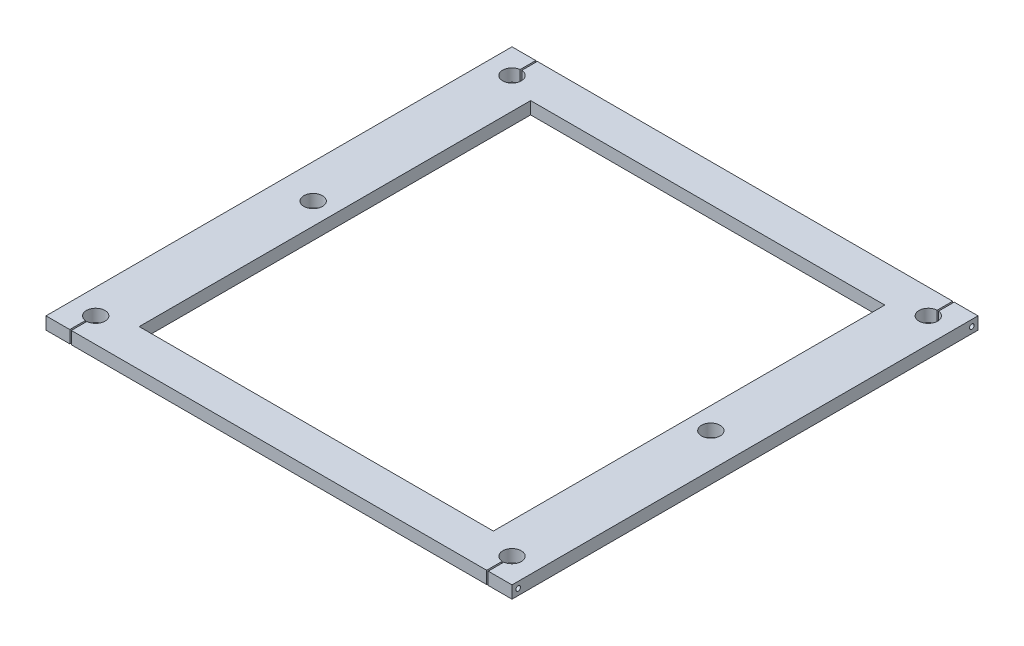
ISO-10303-21;
HEADER;
FILE_DESCRIPTION(('STEP AP214'),'2;1');
FILE_NAME('part.step','',(''),(''),'','','');
FILE_SCHEMA(('AUTOMOTIVE_DESIGN { 1 0 10303 214 1 1 1 1 }'));
ENDSEC;
DATA;
#1=APPLICATION_CONTEXT('core data for automotive mechanical design processes');
#2=APPLICATION_PROTOCOL_DEFINITION('international standard','automotive_design',2000,#1);
#3=PRODUCT_CONTEXT('',#1,'mechanical');
#4=PRODUCT('Part','Part','',(#3));
#5=PRODUCT_RELATED_PRODUCT_CATEGORY('part','',(#4));
#6=PRODUCT_DEFINITION_FORMATION('','',#4);
#7=PRODUCT_DEFINITION_CONTEXT('part definition',#1,'design');
#8=PRODUCT_DEFINITION('design','',#6,#7);
#9=PRODUCT_DEFINITION_SHAPE('','',#8);
#10=(LENGTH_UNIT() NAMED_UNIT(*) SI_UNIT(.MILLI.,.METRE.));
#11=(NAMED_UNIT(*) PLANE_ANGLE_UNIT() SI_UNIT($,.RADIAN.));
#12=(NAMED_UNIT(*) SI_UNIT($,.STERADIAN.) SOLID_ANGLE_UNIT());
#13=UNCERTAINTY_MEASURE_WITH_UNIT(LENGTH_MEASURE(1.E-05),#10,'distance_accuracy_value','');
#14=(GEOMETRIC_REPRESENTATION_CONTEXT(3) GLOBAL_UNCERTAINTY_ASSIGNED_CONTEXT((#13)) GLOBAL_UNIT_ASSIGNED_CONTEXT((#10,
#11,#12)) REPRESENTATION_CONTEXT('',''));
#15=CARTESIAN_POINT('',(0.,0.,0.));
#16=DIRECTION('',(0.,0.,1.));
#17=DIRECTION('',(1.,0.,0.));
#18=AXIS2_PLACEMENT_3D('',#15,#16,#17);
#19=CARTESIAN_POINT('',(0.,8.,0.));
#20=DIRECTION('',(0.,-1.,0.));
#21=DIRECTION('',(0.,0.,-1.));
#22=AXIS2_PLACEMENT_3D('',#19,#20,#21);
#23=PLANE('',#22);
#24=CARTESIAN_POINT('',(128.,8.,0.));
#25=DIRECTION('',(0.,-1.,0.));
#26=DIRECTION('',(0.,0.,1.));
#27=AXIS2_PLACEMENT_3D('',#24,#25,#26);
#28=CIRCLE('',#27,6.);
#29=CARTESIAN_POINT('',(128.,8.,6.00000000000002));
#30=VERTEX_POINT('',#29);
#31=EDGE_CURVE('E406',#30,#30,#28,.T.);
#32=ORIENTED_EDGE('',*,*,#31,.T.);
#33=EDGE_LOOP('',(#32));
#34=FACE_BOUND('',#33,.T.);
#35=DIRECTION('',(0.,0.,-1.));
#36=VECTOR('',#35,1.);
#37=CARTESIAN_POINT('',(-133.7,8.,150.));
#38=LINE('',#37,#36);
#39=CARTESIAN_POINT('',(-133.7,8.,150.));
#40=VERTEX_POINT('',#39);
#41=CARTESIAN_POINT('',(-133.7,8.,139.992495306631));
#42=VERTEX_POINT('',#41);
#43=EDGE_CURVE('E196',#40,#42,#38,.T.);
#44=ORIENTED_EDGE('',*,*,#43,.F.);
#45=DIRECTION('',(1.,0.,0.));
#46=VECTOR('',#45,1.);
#47=CARTESIAN_POINT('',(-150.,8.,150.));
#48=LINE('',#47,#46);
#49=CARTESIAN_POINT('',(133.7,8.,150.));
#50=VERTEX_POINT('',#49);
#51=EDGE_CURVE('E359',#40,#50,#48,.T.);
#52=ORIENTED_EDGE('',*,*,#51,.T.);
#53=DIRECTION('',(0.,0.,-1.));
#54=VECTOR('',#53,1.);
#55=CARTESIAN_POINT('',(133.7,8.,150.));
#56=LINE('',#55,#54);
#57=CARTESIAN_POINT('',(133.7,8.,139.992495306631));
#58=VERTEX_POINT('',#57);
#59=EDGE_CURVE('E260',#50,#58,#56,.T.);
#60=ORIENTED_EDGE('',*,*,#59,.T.);
#61=CARTESIAN_POINT('',(134.,8.,134.));
#62=DIRECTION('',(0.,-1.,0.));
#63=DIRECTION('',(0.,0.,-1.));
#64=AXIS2_PLACEMENT_3D('',#61,#62,#63);
#65=CIRCLE('',#64,6.);
#66=CARTESIAN_POINT('',(134.7,8.,139.959026766176));
#67=VERTEX_POINT('',#66);
#68=EDGE_CURVE('E267',#58,#67,#65,.T.);
#69=ORIENTED_EDGE('',*,*,#68,.T.);
#70=DIRECTION('',(0.,0.,1.));
#71=VECTOR('',#70,1.);
#72=CARTESIAN_POINT('',(134.7,8.,150.));
#73=LINE('',#72,#71);
#74=CARTESIAN_POINT('',(134.7,8.,150.));
#75=VERTEX_POINT('',#74);
#76=EDGE_CURVE('E263',#67,#75,#73,.T.);
#77=ORIENTED_EDGE('',*,*,#76,.T.);
#78=CARTESIAN_POINT('',(150.,8.,150.));
#79=VERTEX_POINT('',#78);
#80=EDGE_CURVE('E355',#75,#79,#48,.T.);
#81=ORIENTED_EDGE('',*,*,#80,.T.);
#82=DIRECTION('',(0.,0.,-1.));
#83=VECTOR('',#82,1.);
#84=CARTESIAN_POINT('',(150.,8.,-150.));
#85=LINE('',#84,#83);
#86=CARTESIAN_POINT('',(150.,8.,-150.));
#87=VERTEX_POINT('',#86);
#88=EDGE_CURVE('E358',#79,#87,#85,.T.);
#89=ORIENTED_EDGE('',*,*,#88,.T.);
#90=DIRECTION('',(-1.,0.,0.));
#91=VECTOR('',#90,1.);
#92=CARTESIAN_POINT('',(-150.,8.,-150.));
#93=LINE('',#92,#91);
#94=CARTESIAN_POINT('',(134.7,8.,-150.));
#95=VERTEX_POINT('',#94);
#96=EDGE_CURVE('E348',#87,#95,#93,.T.);
#97=ORIENTED_EDGE('',*,*,#96,.T.);
#98=DIRECTION('',(0.,0.,-1.));
#99=VECTOR('',#98,1.);
#100=CARTESIAN_POINT('',(134.7,8.,-150.));
#101=LINE('',#100,#99);
#102=CARTESIAN_POINT('',(134.7,8.,-139.959026766176));
#103=VERTEX_POINT('',#102);
#104=EDGE_CURVE('E296',#103,#95,#101,.T.);
#105=ORIENTED_EDGE('',*,*,#104,.F.);
#106=CARTESIAN_POINT('',(134.,8.,-134.));
#107=DIRECTION('',(0.,1.,0.));
#108=DIRECTION('',(0.,0.,1.));
#109=AXIS2_PLACEMENT_3D('',#106,#107,#108);
#110=CIRCLE('',#109,6.);
#111=CARTESIAN_POINT('',(133.7,8.,-139.992495306631));
#112=VERTEX_POINT('',#111);
#113=EDGE_CURVE('E293',#112,#103,#110,.T.);
#114=ORIENTED_EDGE('',*,*,#113,.F.);
#115=DIRECTION('',(0.,0.,1.));
#116=VECTOR('',#115,1.);
#117=CARTESIAN_POINT('',(133.7,8.,-150.));
#118=LINE('',#117,#116);
#119=CARTESIAN_POINT('',(133.7,8.,-150.));
#120=VERTEX_POINT('',#119);
#121=EDGE_CURVE('E291',#120,#112,#118,.T.);
#122=ORIENTED_EDGE('',*,*,#121,.F.);
#123=CARTESIAN_POINT('',(-133.7,8.,-150.));
#124=VERTEX_POINT('',#123);
#125=EDGE_CURVE('E352',#120,#124,#93,.T.);
#126=ORIENTED_EDGE('',*,*,#125,.T.);
#127=DIRECTION('',(0.,0.,1.));
#128=VECTOR('',#127,1.);
#129=CARTESIAN_POINT('',(-133.7,8.,-150.));
#130=LINE('',#129,#128);
#131=CARTESIAN_POINT('',(-133.7,8.,-139.992495306631));
#132=VERTEX_POINT('',#131);
#133=EDGE_CURVE('E233',#124,#132,#130,.T.);
#134=ORIENTED_EDGE('',*,*,#133,.T.);
#135=CARTESIAN_POINT('',(-134.,8.,-134.));
#136=DIRECTION('',(0.,-1.,0.));
#137=DIRECTION('',(0.,0.,1.));
#138=AXIS2_PLACEMENT_3D('',#135,#136,#137);
#139=CIRCLE('',#138,6.);
#140=CARTESIAN_POINT('',(-134.7,8.,-139.959026766176));
#141=VERTEX_POINT('',#140);
#142=EDGE_CURVE('E240',#132,#141,#139,.T.);
#143=ORIENTED_EDGE('',*,*,#142,.T.);
#144=DIRECTION('',(0.,0.,-1.));
#145=VECTOR('',#144,1.);
#146=CARTESIAN_POINT('',(-134.7,8.,-150.));
#147=LINE('',#146,#145);
#148=CARTESIAN_POINT('',(-134.7,8.,-150.));
#149=VERTEX_POINT('',#148);
#150=EDGE_CURVE('E236',#141,#149,#147,.T.);
#151=ORIENTED_EDGE('',*,*,#150,.T.);
#152=CARTESIAN_POINT('',(-150.,8.,-150.));
#153=VERTEX_POINT('',#152);
#154=EDGE_CURVE('E353',#149,#153,#93,.T.);
#155=ORIENTED_EDGE('',*,*,#154,.T.);
#156=DIRECTION('',(0.,0.,1.));
#157=VECTOR('',#156,1.);
#158=CARTESIAN_POINT('',(-150.,8.,150.));
#159=LINE('',#158,#157);
#160=CARTESIAN_POINT('',(-150.,8.,150.));
#161=VERTEX_POINT('',#160);
#162=EDGE_CURVE('E351',#153,#161,#159,.T.);
#163=ORIENTED_EDGE('',*,*,#162,.T.);
#164=CARTESIAN_POINT('',(-134.7,8.,150.));
#165=VERTEX_POINT('',#164);
#166=EDGE_CURVE('E356',#161,#165,#48,.T.);
#167=ORIENTED_EDGE('',*,*,#166,.T.);
#168=DIRECTION('',(0.,0.,1.));
#169=VECTOR('',#168,1.);
#170=CARTESIAN_POINT('',(-134.7,8.,150.));
#171=LINE('',#170,#169);
#172=CARTESIAN_POINT('',(-134.7,8.,139.959026766176));
#173=VERTEX_POINT('',#172);
#174=EDGE_CURVE('E220',#173,#165,#171,.T.);
#175=ORIENTED_EDGE('',*,*,#174,.F.);
#176=CARTESIAN_POINT('',(-134.,8.,134.));
#177=DIRECTION('',(0.,1.,0.));
#178=DIRECTION('',(0.,0.,-1.));
#179=AXIS2_PLACEMENT_3D('',#176,#177,#178);
#180=CIRCLE('',#179,6.);
#181=EDGE_CURVE('E206',#42,#173,#180,.T.);
#182=ORIENTED_EDGE('',*,*,#181,.F.);
#183=EDGE_LOOP('',(#44,#52,#60,#69,#77,#81,#89,#97,#105,#114,#122,#126,#134,#143,#151,#155,#163,
#167,#175,#182));
#184=FACE_BOUND('',#183,.T.);
#185=DIRECTION('',(0.,0.,-1.));
#186=VECTOR('',#185,1.);
#187=CARTESIAN_POINT('',(114.,8.,126.));
#188=LINE('',#187,#186);
#189=CARTESIAN_POINT('',(114.,8.,126.));
#190=VERTEX_POINT('',#189);
#191=CARTESIAN_POINT('',(114.,8.,-126.));
#192=VERTEX_POINT('',#191);
#193=EDGE_CURVE('E317',#190,#192,#188,.T.);
#194=ORIENTED_EDGE('',*,*,#193,.F.);
#195=DIRECTION('',(1.,0.,0.));
#196=VECTOR('',#195,1.);
#197=CARTESIAN_POINT('',(-114.,8.,126.));
#198=LINE('',#197,#196);
#199=CARTESIAN_POINT('',(-114.,8.,126.));
#200=VERTEX_POINT('',#199);
#201=EDGE_CURVE('E325',#200,#190,#198,.T.);
#202=ORIENTED_EDGE('',*,*,#201,.F.);
#203=DIRECTION('',(0.,0.,1.));
#204=VECTOR('',#203,1.);
#205=CARTESIAN_POINT('',(-114.,8.,126.));
#206=LINE('',#205,#204);
#207=CARTESIAN_POINT('',(-114.,8.,-126.));
#208=VERTEX_POINT('',#207);
#209=EDGE_CURVE('E322',#208,#200,#206,.T.);
#210=ORIENTED_EDGE('',*,*,#209,.F.);
#211=DIRECTION('',(-1.,0.,0.));
#212=VECTOR('',#211,1.);
#213=CARTESIAN_POINT('',(-114.,8.,-126.));
#214=LINE('',#213,#212);
#215=EDGE_CURVE('E319',#192,#208,#214,.T.);
#216=ORIENTED_EDGE('',*,*,#215,.F.);
#217=EDGE_LOOP('',(#194,#202,#210,#216));
#218=FACE_BOUND('',#217,.T.);
#219=CARTESIAN_POINT('',(-128.,8.,0.));
#220=DIRECTION('',(0.,1.,0.));
#221=DIRECTION('',(0.,0.,1.));
#222=AXIS2_PLACEMENT_3D('',#219,#220,#221);
#223=CIRCLE('',#222,6.);
#224=CARTESIAN_POINT('',(-128.,8.,6.00000000000002));
#225=VERTEX_POINT('',#224);
#226=EDGE_CURVE('E402',#225,#225,#223,.T.);
#227=ORIENTED_EDGE('',*,*,#226,.F.);
#228=EDGE_LOOP('',(#227));
#229=FACE_BOUND('',#228,.T.);
#230=ADVANCED_FACE('F32',(#34,#184,#218,#229),#23,.F.);
#231=CARTESIAN_POINT('',(0.,0.,0.));
#232=DIRECTION('',(0.,-1.,0.));
#233=DIRECTION('',(0.,0.,-1.));
#234=AXIS2_PLACEMENT_3D('',#231,#232,#233);
#235=PLANE('',#234);
#236=CARTESIAN_POINT('',(128.,0.,0.));
#237=DIRECTION('',(0.,-1.,0.));
#238=DIRECTION('',(0.,0.,1.));
#239=AXIS2_PLACEMENT_3D('',#236,#237,#238);
#240=CIRCLE('',#239,6.);
#241=CARTESIAN_POINT('',(128.,0.,6.00000000000002));
#242=VERTEX_POINT('',#241);
#243=EDGE_CURVE('E409',#242,#242,#240,.T.);
#244=ORIENTED_EDGE('',*,*,#243,.F.);
#245=EDGE_LOOP('',(#244));
#246=FACE_BOUND('',#245,.T.);
#247=DIRECTION('',(1.,0.,0.));
#248=VECTOR('',#247,1.);
#249=CARTESIAN_POINT('',(-150.,0.,150.));
#250=LINE('',#249,#248);
#251=CARTESIAN_POINT('',(-133.7,0.,150.));
#252=VERTEX_POINT('',#251);
#253=CARTESIAN_POINT('',(133.7,0.,150.));
#254=VERTEX_POINT('',#253);
#255=EDGE_CURVE('E373',#252,#254,#250,.T.);
#256=ORIENTED_EDGE('',*,*,#255,.F.);
#257=DIRECTION('',(0.,0.,-1.));
#258=VECTOR('',#257,1.);
#259=CARTESIAN_POINT('',(-133.7,0.,150.));
#260=LINE('',#259,#258);
#261=CARTESIAN_POINT('',(-133.7,0.,139.992495306631));
#262=VERTEX_POINT('',#261);
#263=EDGE_CURVE('E225',#252,#262,#260,.T.);
#264=ORIENTED_EDGE('',*,*,#263,.T.);
#265=CARTESIAN_POINT('',(-134.,0.,134.));
#266=DIRECTION('',(0.,1.,0.));
#267=DIRECTION('',(0.,0.,-1.));
#268=AXIS2_PLACEMENT_3D('',#265,#266,#267);
#269=CIRCLE('',#268,6.);
#270=CARTESIAN_POINT('',(-134.7,0.,139.959026766176));
#271=VERTEX_POINT('',#270);
#272=EDGE_CURVE('E213',#262,#271,#269,.T.);
#273=ORIENTED_EDGE('',*,*,#272,.T.);
#274=DIRECTION('',(0.,0.,1.));
#275=VECTOR('',#274,1.);
#276=CARTESIAN_POINT('',(-134.7,0.,150.));
#277=LINE('',#276,#275);
#278=CARTESIAN_POINT('',(-134.7,0.,150.));
#279=VERTEX_POINT('',#278);
#280=EDGE_CURVE('E207',#271,#279,#277,.T.);
#281=ORIENTED_EDGE('',*,*,#280,.T.);
#282=CARTESIAN_POINT('',(-150.,0.,150.));
#283=VERTEX_POINT('',#282);
#284=EDGE_CURVE('E369',#283,#279,#250,.T.);
#285=ORIENTED_EDGE('',*,*,#284,.F.);
#286=DIRECTION('',(0.,0.,1.));
#287=VECTOR('',#286,1.);
#288=CARTESIAN_POINT('',(-150.,0.,150.));
#289=LINE('',#288,#287);
#290=CARTESIAN_POINT('',(-150.,0.,-150.));
#291=VERTEX_POINT('',#290);
#292=EDGE_CURVE('E365',#291,#283,#289,.T.);
#293=ORIENTED_EDGE('',*,*,#292,.F.);
#294=DIRECTION('',(-1.,0.,0.));
#295=VECTOR('',#294,1.);
#296=CARTESIAN_POINT('',(-150.,0.,-150.));
#297=LINE('',#296,#295);
#298=CARTESIAN_POINT('',(-134.7,0.,-150.));
#299=VERTEX_POINT('',#298);
#300=EDGE_CURVE('E347',#299,#291,#297,.T.);
#301=ORIENTED_EDGE('',*,*,#300,.F.);
#302=DIRECTION('',(0.,0.,-1.));
#303=VECTOR('',#302,1.);
#304=CARTESIAN_POINT('',(-134.7,0.,-150.));
#305=LINE('',#304,#303);
#306=CARTESIAN_POINT('',(-134.7,0.,-139.959026766176));
#307=VERTEX_POINT('',#306);
#308=EDGE_CURVE('E57',#307,#299,#305,.T.);
#309=ORIENTED_EDGE('',*,*,#308,.F.);
#310=CARTESIAN_POINT('',(-134.,0.,-134.));
#311=DIRECTION('',(0.,-1.,0.));
#312=DIRECTION('',(0.,0.,1.));
#313=AXIS2_PLACEMENT_3D('',#310,#311,#312);
#314=CIRCLE('',#313,6.);
#315=CARTESIAN_POINT('',(-133.7,0.,-139.992495306631));
#316=VERTEX_POINT('',#315);
#317=EDGE_CURVE('E237',#316,#307,#314,.T.);
#318=ORIENTED_EDGE('',*,*,#317,.F.);
#319=DIRECTION('',(0.,0.,1.));
#320=VECTOR('',#319,1.);
#321=CARTESIAN_POINT('',(-133.7,0.,-150.));
#322=LINE('',#321,#320);
#323=CARTESIAN_POINT('',(-133.7,0.,-150.));
#324=VERTEX_POINT('',#323);
#325=EDGE_CURVE('E214',#324,#316,#322,.T.);
#326=ORIENTED_EDGE('',*,*,#325,.F.);
#327=CARTESIAN_POINT('',(133.7,0.,-150.));
#328=VERTEX_POINT('',#327);
#329=EDGE_CURVE('E366',#328,#324,#297,.T.);
#330=ORIENTED_EDGE('',*,*,#329,.F.);
#331=DIRECTION('',(0.,0.,1.));
#332=VECTOR('',#331,1.);
#333=CARTESIAN_POINT('',(133.7,0.,-150.));
#334=LINE('',#333,#332);
#335=CARTESIAN_POINT('',(133.7,0.,-139.992495306631));
#336=VERTEX_POINT('',#335);
#337=EDGE_CURVE('E299',#328,#336,#334,.T.);
#338=ORIENTED_EDGE('',*,*,#337,.T.);
#339=CARTESIAN_POINT('',(134.,0.,-134.));
#340=DIRECTION('',(0.,1.,0.));
#341=DIRECTION('',(0.,0.,1.));
#342=AXIS2_PLACEMENT_3D('',#339,#340,#341);
#343=CIRCLE('',#342,6.);
#344=CARTESIAN_POINT('',(134.7,0.,-139.959026766176));
#345=VERTEX_POINT('',#344);
#346=EDGE_CURVE('E302',#336,#345,#343,.T.);
#347=ORIENTED_EDGE('',*,*,#346,.T.);
#348=DIRECTION('',(0.,0.,-1.));
#349=VECTOR('',#348,1.);
#350=CARTESIAN_POINT('',(134.7,0.,-150.));
#351=LINE('',#350,#349);
#352=CARTESIAN_POINT('',(134.7,0.,-150.));
#353=VERTEX_POINT('',#352);
#354=EDGE_CURVE('E294',#345,#353,#351,.T.);
#355=ORIENTED_EDGE('',*,*,#354,.T.);
#356=CARTESIAN_POINT('',(150.,0.,-150.));
#357=VERTEX_POINT('',#356);
#358=EDGE_CURVE('E362',#357,#353,#297,.T.);
#359=ORIENTED_EDGE('',*,*,#358,.F.);
#360=DIRECTION('',(0.,0.,-1.));
#361=VECTOR('',#360,1.);
#362=CARTESIAN_POINT('',(150.,0.,-150.));
#363=LINE('',#362,#361);
#364=CARTESIAN_POINT('',(150.,0.,150.));
#365=VERTEX_POINT('',#364);
#366=EDGE_CURVE('E372',#365,#357,#363,.T.);
#367=ORIENTED_EDGE('',*,*,#366,.F.);
#368=CARTESIAN_POINT('',(134.7,0.,150.));
#369=VERTEX_POINT('',#368);
#370=EDGE_CURVE('E368',#369,#365,#250,.T.);
#371=ORIENTED_EDGE('',*,*,#370,.F.);
#372=DIRECTION('',(0.,0.,1.));
#373=VECTOR('',#372,1.);
#374=CARTESIAN_POINT('',(134.7,0.,150.));
#375=LINE('',#374,#373);
#376=CARTESIAN_POINT('',(134.7,0.,139.959026766176));
#377=VERTEX_POINT('',#376);
#378=EDGE_CURVE('E274',#377,#369,#375,.T.);
#379=ORIENTED_EDGE('',*,*,#378,.F.);
#380=CARTESIAN_POINT('',(134.,0.,134.));
#381=DIRECTION('',(0.,-1.,0.));
#382=DIRECTION('',(0.,0.,-1.));
#383=AXIS2_PLACEMENT_3D('',#380,#381,#382);
#384=CIRCLE('',#383,6.);
#385=CARTESIAN_POINT('',(133.7,0.,139.992495306631));
#386=VERTEX_POINT('',#385);
#387=EDGE_CURVE('E264',#386,#377,#384,.T.);
#388=ORIENTED_EDGE('',*,*,#387,.F.);
#389=DIRECTION('',(0.,0.,-1.));
#390=VECTOR('',#389,1.);
#391=CARTESIAN_POINT('',(133.7,0.,150.));
#392=LINE('',#391,#390);
#393=EDGE_CURVE('E271',#254,#386,#392,.T.);
#394=ORIENTED_EDGE('',*,*,#393,.F.);
#395=EDGE_LOOP('',(#256,#264,#273,#281,#285,#293,#301,#309,#318,#326,#330,#338,#347,#355,#359,
#367,#371,#379,#388,#394));
#396=FACE_BOUND('',#395,.T.);
#397=DIRECTION('',(1.,0.,0.));
#398=VECTOR('',#397,1.);
#399=CARTESIAN_POINT('',(-114.,0.,126.));
#400=LINE('',#399,#398);
#401=CARTESIAN_POINT('',(-114.,0.,126.));
#402=VERTEX_POINT('',#401);
#403=CARTESIAN_POINT('',(114.,0.,126.));
#404=VERTEX_POINT('',#403);
#405=EDGE_CURVE('E320',#402,#404,#400,.T.);
#406=ORIENTED_EDGE('',*,*,#405,.T.);
#407=DIRECTION('',(0.,0.,-1.));
#408=VECTOR('',#407,1.);
#409=CARTESIAN_POINT('',(114.,0.,126.));
#410=LINE('',#409,#408);
#411=CARTESIAN_POINT('',(114.,0.,-126.));
#412=VERTEX_POINT('',#411);
#413=EDGE_CURVE('E316',#404,#412,#410,.T.);
#414=ORIENTED_EDGE('',*,*,#413,.T.);
#415=DIRECTION('',(-1.,0.,0.));
#416=VECTOR('',#415,1.);
#417=CARTESIAN_POINT('',(-114.,0.,-126.));
#418=LINE('',#417,#416);
#419=CARTESIAN_POINT('',(-114.,0.,-126.));
#420=VERTEX_POINT('',#419);
#421=EDGE_CURVE('E330',#412,#420,#418,.T.);
#422=ORIENTED_EDGE('',*,*,#421,.T.);
#423=DIRECTION('',(0.,0.,1.));
#424=VECTOR('',#423,1.);
#425=CARTESIAN_POINT('',(-114.,0.,126.));
#426=LINE('',#425,#424);
#427=EDGE_CURVE('E333',#420,#402,#426,.T.);
#428=ORIENTED_EDGE('',*,*,#427,.T.);
#429=EDGE_LOOP('',(#406,#414,#422,#428));
#430=FACE_BOUND('',#429,.T.);
#431=CARTESIAN_POINT('',(-128.,0.,0.));
#432=DIRECTION('',(0.,1.,0.));
#433=DIRECTION('',(0.,0.,1.));
#434=AXIS2_PLACEMENT_3D('',#431,#432,#433);
#435=CIRCLE('',#434,6.);
#436=CARTESIAN_POINT('',(-128.,0.,6.00000000000002));
#437=VERTEX_POINT('',#436);
#438=EDGE_CURVE('E403',#437,#437,#435,.T.);
#439=ORIENTED_EDGE('',*,*,#438,.T.);
#440=EDGE_LOOP('',(#439));
#441=FACE_BOUND('',#440,.T.);
#442=ADVANCED_FACE('F423',(#246,#396,#430,#441),#235,.T.);
#443=CARTESIAN_POINT('',(-150.,8.,150.));
#444=DIRECTION('',(1.,0.,0.));
#445=DIRECTION('',(0.,0.,-1.));
#446=AXIS2_PLACEMENT_3D('',#443,#444,#445);
#447=PLANE('',#446);
#448=ORIENTED_EDGE('',*,*,#292,.T.);
#449=DIRECTION('',(0.,-1.,0.));
#450=VECTOR('',#449,1.);
#451=CARTESIAN_POINT('',(-150.,8.,150.));
#452=LINE('',#451,#450);
#453=EDGE_CURVE('E41',#161,#283,#452,.T.);
#454=ORIENTED_EDGE('',*,*,#453,.F.);
#455=ORIENTED_EDGE('',*,*,#162,.F.);
#456=DIRECTION('',(0.,-1.,0.));
#457=VECTOR('',#456,1.);
#458=CARTESIAN_POINT('',(-150.,8.,-150.));
#459=LINE('',#458,#457);
#460=EDGE_CURVE('E11',#153,#291,#459,.T.);
#461=ORIENTED_EDGE('',*,*,#460,.T.);
#462=EDGE_LOOP('',(#448,#454,#455,#461));
#463=FACE_BOUND('',#462,.T.);
#464=CARTESIAN_POINT('',(-150.,4.,146.));
#465=DIRECTION('',(-1.,0.,0.));
#466=DIRECTION('',(0.,0.,1.));
#467=AXIS2_PLACEMENT_3D('',#464,#465,#466);
#468=CIRCLE('',#467,1.5);
#469=CARTESIAN_POINT('',(-150.,4.,147.5));
#470=VERTEX_POINT('',#469);
#471=EDGE_CURVE('E386',#470,#470,#468,.T.);
#472=ORIENTED_EDGE('',*,*,#471,.F.);
#473=EDGE_LOOP('',(#472));
#474=FACE_BOUND('',#473,.T.);
#475=CARTESIAN_POINT('',(-150.,4.,-146.));
#476=DIRECTION('',(1.,0.,0.));
#477=DIRECTION('',(0.,0.,-1.));
#478=AXIS2_PLACEMENT_3D('',#475,#476,#477);
#479=CIRCLE('',#478,1.5);
#480=CARTESIAN_POINT('',(-150.,4.,-147.5));
#481=VERTEX_POINT('',#480);
#482=EDGE_CURVE('E399',#481,#481,#479,.T.);
#483=ORIENTED_EDGE('',*,*,#482,.T.);
#484=EDGE_LOOP('',(#483));
#485=FACE_BOUND('',#484,.T.);
#486=ADVANCED_FACE('F426',(#463,#474,#485),#447,.F.);
#487=CARTESIAN_POINT('',(133.7,8.,-150.));
#488=DIRECTION('',(1.,0.,0.));
#489=DIRECTION('',(0.,0.,-1.));
#490=AXIS2_PLACEMENT_3D('',#487,#488,#489);
#491=PLANE('',#490);
#492=ORIENTED_EDGE('',*,*,#337,.F.);
#493=DIRECTION('',(0.,-1.,0.));
#494=VECTOR('',#493,1.);
#495=CARTESIAN_POINT('',(133.7,8.,-150.));
#496=LINE('',#495,#494);
#497=EDGE_CURVE('E298',#120,#328,#496,.T.);
#498=ORIENTED_EDGE('',*,*,#497,.F.);
#499=ORIENTED_EDGE('',*,*,#121,.T.);
#500=DIRECTION('',(0.,-1.,0.));
#501=VECTOR('',#500,1.);
#502=CARTESIAN_POINT('',(133.7,8.,-139.992495306631));
#503=LINE('',#502,#501);
#504=EDGE_CURVE('E313',#112,#336,#503,.T.);
#505=ORIENTED_EDGE('',*,*,#504,.T.);
#506=EDGE_LOOP('',(#492,#498,#499,#505));
#507=FACE_BOUND('',#506,.T.);
#508=CARTESIAN_POINT('',(133.7,4.,-146.));
#509=DIRECTION('',(1.,0.,0.));
#510=DIRECTION('',(0.,0.,-1.));
#511=AXIS2_PLACEMENT_3D('',#508,#509,#510);
#512=CIRCLE('',#511,1.5);
#513=CARTESIAN_POINT('',(133.7,4.,-147.5));
#514=VERTEX_POINT('',#513);
#515=EDGE_CURVE('E396',#514,#514,#512,.T.);
#516=ORIENTED_EDGE('',*,*,#515,.F.);
#517=EDGE_LOOP('',(#516));
#518=FACE_BOUND('',#517,.T.);
#519=ADVANCED_FACE('F466',(#507,#518),#491,.T.);
#520=CARTESIAN_POINT('',(-133.7,8.,-150.));
#521=DIRECTION('',(1.,0.,0.));
#522=DIRECTION('',(0.,0.,-1.));
#523=AXIS2_PLACEMENT_3D('',#520,#521,#522);
#524=PLANE('',#523);
#525=ORIENTED_EDGE('',*,*,#325,.T.);
#526=DIRECTION('',(0.,-1.,0.));
#527=VECTOR('',#526,1.);
#528=CARTESIAN_POINT('',(-133.7,8.,-139.992495306631));
#529=LINE('',#528,#527);
#530=EDGE_CURVE('E243',#132,#316,#529,.T.);
#531=ORIENTED_EDGE('',*,*,#530,.F.);
#532=ORIENTED_EDGE('',*,*,#133,.F.);
#533=DIRECTION('',(0.,-1.,0.));
#534=VECTOR('',#533,1.);
#535=CARTESIAN_POINT('',(-133.7,8.,-150.));
#536=LINE('',#535,#534);
#537=EDGE_CURVE('E254',#124,#324,#536,.T.);
#538=ORIENTED_EDGE('',*,*,#537,.T.);
#539=EDGE_LOOP('',(#525,#531,#532,#538));
#540=FACE_BOUND('',#539,.T.);
#541=CARTESIAN_POINT('',(-133.7,4.,-146.));
#542=DIRECTION('',(1.,0.,0.));
#543=DIRECTION('',(0.,0.,-1.));
#544=AXIS2_PLACEMENT_3D('',#541,#542,#543);
#545=CIRCLE('',#544,1.5);
#546=CARTESIAN_POINT('',(-133.7,4.,-147.5));
#547=VERTEX_POINT('',#546);
#548=EDGE_CURVE('E390',#547,#547,#545,.F.);
#549=ORIENTED_EDGE('',*,*,#548,.F.);
#550=EDGE_LOOP('',(#549));
#551=FACE_BOUND('',#550,.T.);
#552=ADVANCED_FACE('F471',(#540,#551),#524,.F.);
#553=CARTESIAN_POINT('',(-134.7,8.,-150.));
#554=DIRECTION('',(-1.,0.,0.));
#555=DIRECTION('',(0.,0.,1.));
#556=AXIS2_PLACEMENT_3D('',#553,#554,#555);
#557=PLANE('',#556);
#558=ORIENTED_EDGE('',*,*,#308,.T.);
#559=DIRECTION('',(0.,-1.,0.));
#560=VECTOR('',#559,1.);
#561=CARTESIAN_POINT('',(-134.7,8.,-150.));
#562=LINE('',#561,#560);
#563=EDGE_CURVE('E252',#149,#299,#562,.T.);
#564=ORIENTED_EDGE('',*,*,#563,.F.);
#565=ORIENTED_EDGE('',*,*,#150,.F.);
#566=DIRECTION('',(0.,-1.,0.));
#567=VECTOR('',#566,1.);
#568=CARTESIAN_POINT('',(-134.7,8.,-139.959026766176));
#569=LINE('',#568,#567);
#570=EDGE_CURVE('E250',#141,#307,#569,.T.);
#571=ORIENTED_EDGE('',*,*,#570,.T.);
#572=EDGE_LOOP('',(#558,#564,#565,#571));
#573=FACE_BOUND('',#572,.T.);
#574=CARTESIAN_POINT('',(-134.7,4.,-146.));
#575=DIRECTION('',(-1.,0.,0.));
#576=DIRECTION('',(0.,0.,1.));
#577=AXIS2_PLACEMENT_3D('',#574,#575,#576);
#578=CIRCLE('',#577,1.5);
#579=CARTESIAN_POINT('',(-134.7,4.,-144.5));
#580=VERTEX_POINT('',#579);
#581=EDGE_CURVE('E36',#580,#580,#578,.F.);
#582=ORIENTED_EDGE('',*,*,#581,.F.);
#583=EDGE_LOOP('',(#582));
#584=FACE_BOUND('',#583,.T.);
#585=ADVANCED_FACE('F486',(#573,#584),#557,.F.);
#586=CARTESIAN_POINT('',(-150.,8.,150.));
#587=DIRECTION('',(0.,0.,-1.));
#588=DIRECTION('',(-1.,0.,0.));
#589=AXIS2_PLACEMENT_3D('',#586,#587,#588);
#590=PLANE('',#589);
#591=DIRECTION('',(0.,-1.,0.));
#592=VECTOR('',#591,1.);
#593=CARTESIAN_POINT('',(-133.7,8.,150.));
#594=LINE('',#593,#592);
#595=EDGE_CURVE('E202',#40,#252,#594,.T.);
#596=ORIENTED_EDGE('',*,*,#595,.T.);
#597=ORIENTED_EDGE('',*,*,#255,.T.);
#598=DIRECTION('',(0.,-1.,0.));
#599=VECTOR('',#598,1.);
#600=CARTESIAN_POINT('',(133.7,8.,150.));
#601=LINE('',#600,#599);
#602=EDGE_CURVE('E284',#50,#254,#601,.T.);
#603=ORIENTED_EDGE('',*,*,#602,.F.);
#604=ORIENTED_EDGE('',*,*,#51,.F.);
#605=EDGE_LOOP('',(#596,#597,#603,#604));
#606=FACE_BOUND('',#605,.T.);
#607=ADVANCED_FACE('F463',(#606),#590,.F.);
#608=DIRECTION('',(0.,-1.,0.));
#609=VECTOR('',#608,1.);
#610=CARTESIAN_POINT('',(-134.7,8.,150.));
#611=LINE('',#610,#609);
#612=EDGE_CURVE('E49',#165,#279,#611,.T.);
#613=ORIENTED_EDGE('',*,*,#612,.F.);
#614=ORIENTED_EDGE('',*,*,#166,.F.);
#615=ORIENTED_EDGE('',*,*,#453,.T.);
#616=ORIENTED_EDGE('',*,*,#284,.T.);
#617=EDGE_LOOP('',(#613,#614,#615,#616));
#618=FACE_BOUND('',#617,.T.);
#619=ADVANCED_FACE('F464',(#618),#590,.F.);
#620=CARTESIAN_POINT('',(-150.,8.,-150.));
#621=DIRECTION('',(0.,0.,1.));
#622=DIRECTION('',(1.,0.,0.));
#623=AXIS2_PLACEMENT_3D('',#620,#621,#622);
#624=PLANE('',#623);
#625=ORIENTED_EDGE('',*,*,#329,.T.);
#626=ORIENTED_EDGE('',*,*,#537,.F.);
#627=ORIENTED_EDGE('',*,*,#125,.F.);
#628=ORIENTED_EDGE('',*,*,#497,.T.);
#629=EDGE_LOOP('',(#625,#626,#627,#628));
#630=FACE_BOUND('',#629,.T.);
#631=ADVANCED_FACE('F457',(#630),#624,.F.);
#632=CARTESIAN_POINT('',(150.,8.,-150.));
#633=DIRECTION('',(-1.,0.,0.));
#634=DIRECTION('',(0.,0.,1.));
#635=AXIS2_PLACEMENT_3D('',#632,#633,#634);
#636=PLANE('',#635);
#637=ORIENTED_EDGE('',*,*,#366,.T.);
#638=DIRECTION('',(0.,-1.,0.));
#639=VECTOR('',#638,1.);
#640=CARTESIAN_POINT('',(150.,8.,-150.));
#641=LINE('',#640,#639);
#642=EDGE_CURVE('E361',#87,#357,#641,.T.);
#643=ORIENTED_EDGE('',*,*,#642,.F.);
#644=ORIENTED_EDGE('',*,*,#88,.F.);
#645=DIRECTION('',(0.,-1.,0.));
#646=VECTOR('',#645,1.);
#647=CARTESIAN_POINT('',(150.,8.,150.));
#648=LINE('',#647,#646);
#649=EDGE_CURVE('E377',#79,#365,#648,.T.);
#650=ORIENTED_EDGE('',*,*,#649,.T.);
#651=EDGE_LOOP('',(#637,#643,#644,#650));
#652=FACE_BOUND('',#651,.T.);
#653=CARTESIAN_POINT('',(150.,4.,-146.));
#654=DIRECTION('',(1.,0.,0.));
#655=DIRECTION('',(0.,0.,-1.));
#656=AXIS2_PLACEMENT_3D('',#653,#654,#655);
#657=CIRCLE('',#656,1.5);
#658=CARTESIAN_POINT('',(150.,4.,-147.5));
#659=VERTEX_POINT('',#658);
#660=EDGE_CURVE('E287',#659,#659,#657,.T.);
#661=ORIENTED_EDGE('',*,*,#660,.F.);
#662=EDGE_LOOP('',(#661));
#663=FACE_BOUND('',#662,.T.);
#664=CARTESIAN_POINT('',(150.,4.,146.));
#665=DIRECTION('',(-1.,0.,0.));
#666=DIRECTION('',(0.,0.,1.));
#667=AXIS2_PLACEMENT_3D('',#664,#665,#666);
#668=CIRCLE('',#667,1.5);
#669=CARTESIAN_POINT('',(150.,4.,147.5));
#670=VERTEX_POINT('',#669);
#671=EDGE_CURVE('E256',#670,#670,#668,.T.);
#672=ORIENTED_EDGE('',*,*,#671,.T.);
#673=EDGE_LOOP('',(#672));
#674=FACE_BOUND('',#673,.T.);
#675=ADVANCED_FACE('F453',(#652,#663,#674),#636,.F.);
#676=CARTESIAN_POINT('',(134.7,8.,150.));
#677=DIRECTION('',(1.,0.,0.));
#678=DIRECTION('',(0.,0.,-1.));
#679=AXIS2_PLACEMENT_3D('',#676,#677,#678);
#680=PLANE('',#679);
#681=ORIENTED_EDGE('',*,*,#378,.T.);
#682=DIRECTION('',(0.,-1.,0.));
#683=VECTOR('',#682,1.);
#684=CARTESIAN_POINT('',(134.7,8.,150.));
#685=LINE('',#684,#683);
#686=EDGE_CURVE('E281',#75,#369,#685,.T.);
#687=ORIENTED_EDGE('',*,*,#686,.F.);
#688=ORIENTED_EDGE('',*,*,#76,.F.);
#689=DIRECTION('',(0.,-1.,0.));
#690=VECTOR('',#689,1.);
#691=CARTESIAN_POINT('',(134.7,8.,139.959026766176));
#692=LINE('',#691,#690);
#693=EDGE_CURVE('E279',#67,#377,#692,.T.);
#694=ORIENTED_EDGE('',*,*,#693,.T.);
#695=EDGE_LOOP('',(#681,#687,#688,#694));
#696=FACE_BOUND('',#695,.T.);
#697=CARTESIAN_POINT('',(134.7,4.,146.));
#698=DIRECTION('',(1.,0.,0.));
#699=DIRECTION('',(0.,0.,-1.));
#700=AXIS2_PLACEMENT_3D('',#697,#698,#699);
#701=CIRCLE('',#700,1.5);
#702=CARTESIAN_POINT('',(134.7,4.,144.5));
#703=VERTEX_POINT('',#702);
#704=EDGE_CURVE('E259',#703,#703,#701,.F.);
#705=ORIENTED_EDGE('',*,*,#704,.F.);
#706=EDGE_LOOP('',(#705));
#707=FACE_BOUND('',#706,.T.);
#708=ADVANCED_FACE('F456',(#696,#707),#680,.F.);
#709=ORIENTED_EDGE('',*,*,#154,.F.);
#710=ORIENTED_EDGE('',*,*,#563,.T.);
#711=ORIENTED_EDGE('',*,*,#300,.T.);
#712=ORIENTED_EDGE('',*,*,#460,.F.);
#713=EDGE_LOOP('',(#709,#710,#711,#712));
#714=FACE_BOUND('',#713,.T.);
#715=ADVANCED_FACE('F34',(#714),#624,.F.);
#716=DIRECTION('',(0.,-1.,0.));
#717=VECTOR('',#716,1.);
#718=CARTESIAN_POINT('',(134.7,8.,-150.));
#719=LINE('',#718,#717);
#720=EDGE_CURVE('E309',#95,#353,#719,.T.);
#721=ORIENTED_EDGE('',*,*,#720,.F.);
#722=ORIENTED_EDGE('',*,*,#96,.F.);
#723=ORIENTED_EDGE('',*,*,#642,.T.);
#724=ORIENTED_EDGE('',*,*,#358,.T.);
#725=EDGE_LOOP('',(#721,#722,#723,#724));
#726=FACE_BOUND('',#725,.T.);
#727=ADVANCED_FACE('F461',(#726),#624,.F.);
#728=ORIENTED_EDGE('',*,*,#80,.F.);
#729=ORIENTED_EDGE('',*,*,#686,.T.);
#730=ORIENTED_EDGE('',*,*,#370,.T.);
#731=ORIENTED_EDGE('',*,*,#649,.F.);
#732=EDGE_LOOP('',(#728,#729,#730,#731));
#733=FACE_BOUND('',#732,.T.);
#734=ADVANCED_FACE('F459',(#733),#590,.F.);
#735=CARTESIAN_POINT('',(114.,8.,126.));
#736=DIRECTION('',(-1.,0.,0.));
#737=DIRECTION('',(0.,0.,1.));
#738=AXIS2_PLACEMENT_3D('',#735,#736,#737);
#739=PLANE('',#738);
#740=ORIENTED_EDGE('',*,*,#413,.F.);
#741=DIRECTION('',(0.,-1.,0.));
#742=VECTOR('',#741,1.);
#743=CARTESIAN_POINT('',(114.,8.,126.));
#744=LINE('',#743,#742);
#745=EDGE_CURVE('E327',#190,#404,#744,.T.);
#746=ORIENTED_EDGE('',*,*,#745,.F.);
#747=ORIENTED_EDGE('',*,*,#193,.T.);
#748=DIRECTION('',(0.,-1.,0.));
#749=VECTOR('',#748,1.);
#750=CARTESIAN_POINT('',(114.,8.,-126.));
#751=LINE('',#750,#749);
#752=EDGE_CURVE('E344',#192,#412,#751,.T.);
#753=ORIENTED_EDGE('',*,*,#752,.T.);
#754=EDGE_LOOP('',(#740,#746,#747,#753));
#755=FACE_BOUND('',#754,.T.);
#756=ADVANCED_FACE('F450',(#755),#739,.T.);
#757=CARTESIAN_POINT('',(-114.,8.,-126.));
#758=DIRECTION('',(0.,0.,1.));
#759=DIRECTION('',(1.,0.,0.));
#760=AXIS2_PLACEMENT_3D('',#757,#758,#759);
#761=PLANE('',#760);
#762=ORIENTED_EDGE('',*,*,#421,.F.);
#763=ORIENTED_EDGE('',*,*,#752,.F.);
#764=ORIENTED_EDGE('',*,*,#215,.T.);
#765=DIRECTION('',(0.,-1.,0.));
#766=VECTOR('',#765,1.);
#767=CARTESIAN_POINT('',(-114.,8.,-126.));
#768=LINE('',#767,#766);
#769=EDGE_CURVE('E342',#208,#420,#768,.T.);
#770=ORIENTED_EDGE('',*,*,#769,.T.);
#771=EDGE_LOOP('',(#762,#763,#764,#770));
#772=FACE_BOUND('',#771,.T.);
#773=ADVANCED_FACE('F533',(#772),#761,.T.);
#774=CARTESIAN_POINT('',(-114.,8.,126.));
#775=DIRECTION('',(1.,0.,0.));
#776=DIRECTION('',(0.,0.,-1.));
#777=AXIS2_PLACEMENT_3D('',#774,#775,#776);
#778=PLANE('',#777);
#779=ORIENTED_EDGE('',*,*,#427,.F.);
#780=ORIENTED_EDGE('',*,*,#769,.F.);
#781=ORIENTED_EDGE('',*,*,#209,.T.);
#782=DIRECTION('',(0.,-1.,0.));
#783=VECTOR('',#782,1.);
#784=CARTESIAN_POINT('',(-114.,8.,126.));
#785=LINE('',#784,#783);
#786=EDGE_CURVE('E340',#200,#402,#785,.T.);
#787=ORIENTED_EDGE('',*,*,#786,.T.);
#788=EDGE_LOOP('',(#779,#780,#781,#787));
#789=FACE_BOUND('',#788,.T.);
#790=ADVANCED_FACE('F530',(#789),#778,.T.);
#791=CARTESIAN_POINT('',(-114.,8.,126.));
#792=DIRECTION('',(0.,0.,-1.));
#793=DIRECTION('',(-1.,0.,0.));
#794=AXIS2_PLACEMENT_3D('',#791,#792,#793);
#795=PLANE('',#794);
#796=ORIENTED_EDGE('',*,*,#405,.F.);
#797=ORIENTED_EDGE('',*,*,#786,.F.);
#798=ORIENTED_EDGE('',*,*,#201,.T.);
#799=ORIENTED_EDGE('',*,*,#745,.T.);
#800=EDGE_LOOP('',(#796,#797,#798,#799));
#801=FACE_BOUND('',#800,.T.);
#802=ADVANCED_FACE('F525',(#801),#795,.T.);
#803=CARTESIAN_POINT('',(134.,8.,-134.));
#804=DIRECTION('',(0.,-1.,0.));
#805=DIRECTION('',(0.,0.,-1.));
#806=AXIS2_PLACEMENT_3D('',#803,#804,#805);
#807=CYLINDRICAL_SURFACE('',#806,6.);
#808=ORIENTED_EDGE('',*,*,#346,.F.);
#809=ORIENTED_EDGE('',*,*,#504,.F.);
#810=ORIENTED_EDGE('',*,*,#113,.T.);
#811=DIRECTION('',(0.,-1.,0.));
#812=VECTOR('',#811,1.);
#813=CARTESIAN_POINT('',(134.7,8.,-139.959026766176));
#814=LINE('',#813,#812);
#815=EDGE_CURVE('E311',#103,#345,#814,.T.);
#816=ORIENTED_EDGE('',*,*,#815,.T.);
#817=EDGE_LOOP('',(#808,#809,#810,#816));
#818=FACE_BOUND('',#817,.T.);
#819=ADVANCED_FACE('F522',(#818),#807,.F.);
#820=CARTESIAN_POINT('',(134.7,8.,-150.));
#821=DIRECTION('',(-1.,0.,0.));
#822=DIRECTION('',(0.,0.,1.));
#823=AXIS2_PLACEMENT_3D('',#820,#821,#822);
#824=PLANE('',#823);
#825=CARTESIAN_POINT('',(134.7,4.,-146.));
#826=DIRECTION('',(-1.,0.,0.));
#827=DIRECTION('',(0.,0.,1.));
#828=AXIS2_PLACEMENT_3D('',#825,#826,#827);
#829=CIRCLE('',#828,1.5);
#830=CARTESIAN_POINT('',(134.7,4.,-144.5));
#831=VERTEX_POINT('',#830);
#832=EDGE_CURVE('E290',#831,#831,#829,.T.);
#833=ORIENTED_EDGE('',*,*,#832,.F.);
#834=EDGE_LOOP('',(#833));
#835=FACE_BOUND('',#834,.T.);
#836=ORIENTED_EDGE('',*,*,#354,.F.);
#837=ORIENTED_EDGE('',*,*,#815,.F.);
#838=ORIENTED_EDGE('',*,*,#104,.T.);
#839=ORIENTED_EDGE('',*,*,#720,.T.);
#840=EDGE_LOOP('',(#836,#837,#838,#839));
#841=FACE_BOUND('',#840,.T.);
#842=ADVANCED_FACE('F518',(#835,#841),#824,.T.);
#843=CARTESIAN_POINT('',(129.457359312881,4.,-146.));
#844=DIRECTION('',(1.,0.,0.));
#845=DIRECTION('',(0.,0.,-1.));
#846=AXIS2_PLACEMENT_3D('',#843,#844,#845);
#847=CYLINDRICAL_SURFACE('',#846,1.5);
#848=ORIENTED_EDGE('',*,*,#832,.T.);
#849=EDGE_LOOP('',(#848));
#850=FACE_BOUND('',#849,.T.);
#851=ORIENTED_EDGE('',*,*,#660,.T.);
#852=EDGE_LOOP('',(#851));
#853=FACE_BOUND('',#852,.T.);
#854=ADVANCED_FACE('F514',(#850,#853),#847,.F.);
#855=CARTESIAN_POINT('',(133.7,8.,150.));
#856=DIRECTION('',(-1.,0.,0.));
#857=DIRECTION('',(0.,0.,1.));
#858=AXIS2_PLACEMENT_3D('',#855,#856,#857);
#859=PLANE('',#858);
#860=ORIENTED_EDGE('',*,*,#393,.T.);
#861=DIRECTION('',(0.,-1.,0.));
#862=VECTOR('',#861,1.);
#863=CARTESIAN_POINT('',(133.7,8.,139.992495306631));
#864=LINE('',#863,#862);
#865=EDGE_CURVE('E270',#58,#386,#864,.T.);
#866=ORIENTED_EDGE('',*,*,#865,.F.);
#867=ORIENTED_EDGE('',*,*,#59,.F.);
#868=ORIENTED_EDGE('',*,*,#602,.T.);
#869=EDGE_LOOP('',(#860,#866,#867,#868));
#870=FACE_BOUND('',#869,.T.);
#871=ADVANCED_FACE('F507',(#870),#859,.F.);
#872=CARTESIAN_POINT('',(134.,8.,134.));
#873=DIRECTION('',(0.,-1.,0.));
#874=DIRECTION('',(0.,0.,-1.));
#875=AXIS2_PLACEMENT_3D('',#872,#873,#874);
#876=CYLINDRICAL_SURFACE('',#875,6.);
#877=ORIENTED_EDGE('',*,*,#387,.T.);
#878=ORIENTED_EDGE('',*,*,#693,.F.);
#879=ORIENTED_EDGE('',*,*,#68,.F.);
#880=ORIENTED_EDGE('',*,*,#865,.T.);
#881=EDGE_LOOP('',(#877,#878,#879,#880));
#882=FACE_BOUND('',#881,.T.);
#883=ADVANCED_FACE('F503',(#882),#876,.F.);
#884=CARTESIAN_POINT('',(129.457359312881,4.,146.));
#885=DIRECTION('',(1.,0.,0.));
#886=DIRECTION('',(0.,0.,-1.));
#887=AXIS2_PLACEMENT_3D('',#884,#885,#886);
#888=CYLINDRICAL_SURFACE('',#887,1.5);
#889=ORIENTED_EDGE('',*,*,#671,.F.);
#890=EDGE_LOOP('',(#889));
#891=FACE_BOUND('',#890,.T.);
#892=ORIENTED_EDGE('',*,*,#704,.T.);
#893=EDGE_LOOP('',(#892));
#894=FACE_BOUND('',#893,.T.);
#895=ADVANCED_FACE('F500',(#891,#894),#888,.F.);
#896=CARTESIAN_POINT('',(-134.,8.,-134.));
#897=DIRECTION('',(0.,-1.,0.));
#898=DIRECTION('',(0.,0.,-1.));
#899=AXIS2_PLACEMENT_3D('',#896,#897,#898);
#900=CYLINDRICAL_SURFACE('',#899,6.);
#901=ORIENTED_EDGE('',*,*,#317,.T.);
#902=ORIENTED_EDGE('',*,*,#570,.F.);
#903=ORIENTED_EDGE('',*,*,#142,.F.);
#904=ORIENTED_EDGE('',*,*,#530,.T.);
#905=EDGE_LOOP('',(#901,#902,#903,#904));
#906=FACE_BOUND('',#905,.T.);
#907=ADVANCED_FACE('F497',(#906),#900,.F.);
#908=CARTESIAN_POINT('',(-133.7,8.,150.));
#909=DIRECTION('',(-1.,0.,0.));
#910=DIRECTION('',(0.,0.,1.));
#911=AXIS2_PLACEMENT_3D('',#908,#909,#910);
#912=PLANE('',#911);
#913=ORIENTED_EDGE('',*,*,#263,.F.);
#914=ORIENTED_EDGE('',*,*,#595,.F.);
#915=ORIENTED_EDGE('',*,*,#43,.T.);
#916=DIRECTION('',(0.,-1.,0.));
#917=VECTOR('',#916,1.);
#918=CARTESIAN_POINT('',(-133.7,8.,139.992495306631));
#919=LINE('',#918,#917);
#920=EDGE_CURVE('E199',#42,#262,#919,.T.);
#921=ORIENTED_EDGE('',*,*,#920,.T.);
#922=EDGE_LOOP('',(#913,#914,#915,#921));
#923=FACE_BOUND('',#922,.T.);
#924=ADVANCED_FACE('F198',(#923),#912,.T.);
#925=CARTESIAN_POINT('',(-134.,8.,134.));
#926=DIRECTION('',(0.,-1.,0.));
#927=DIRECTION('',(0.,0.,-1.));
#928=AXIS2_PLACEMENT_3D('',#925,#926,#927);
#929=CYLINDRICAL_SURFACE('',#928,6.);
#930=ORIENTED_EDGE('',*,*,#272,.F.);
#931=ORIENTED_EDGE('',*,*,#920,.F.);
#932=ORIENTED_EDGE('',*,*,#181,.T.);
#933=DIRECTION('',(0.,-1.,0.));
#934=VECTOR('',#933,1.);
#935=CARTESIAN_POINT('',(-134.7,8.,139.959026766176));
#936=LINE('',#935,#934);
#937=EDGE_CURVE('E215',#173,#271,#936,.T.);
#938=ORIENTED_EDGE('',*,*,#937,.T.);
#939=EDGE_LOOP('',(#930,#931,#932,#938));
#940=FACE_BOUND('',#939,.T.);
#941=ADVANCED_FACE('F210',(#940),#929,.F.);
#942=CARTESIAN_POINT('',(-134.7,8.,150.));
#943=DIRECTION('',(1.,0.,0.));
#944=DIRECTION('',(0.,0.,-1.));
#945=AXIS2_PLACEMENT_3D('',#942,#943,#944);
#946=PLANE('',#945);
#947=CARTESIAN_POINT('',(-134.7,4.,146.));
#948=DIRECTION('',(1.,0.,0.));
#949=DIRECTION('',(0.,0.,-1.));
#950=AXIS2_PLACEMENT_3D('',#947,#948,#949);
#951=CIRCLE('',#950,1.5);
#952=CARTESIAN_POINT('',(-134.7,4.,144.5));
#953=VERTEX_POINT('',#952);
#954=EDGE_CURVE('E227',#953,#953,#951,.T.);
#955=ORIENTED_EDGE('',*,*,#954,.F.);
#956=EDGE_LOOP('',(#955));
#957=FACE_BOUND('',#956,.T.);
#958=ORIENTED_EDGE('',*,*,#280,.F.);
#959=ORIENTED_EDGE('',*,*,#937,.F.);
#960=ORIENTED_EDGE('',*,*,#174,.T.);
#961=ORIENTED_EDGE('',*,*,#612,.T.);
#962=EDGE_LOOP('',(#958,#959,#960,#961));
#963=FACE_BOUND('',#962,.T.);
#964=ADVANCED_FACE('F698',(#957,#963),#946,.T.);
#965=CARTESIAN_POINT('',(137.942640687119,4.,146.));
#966=DIRECTION('',(-1.,0.,0.));
#967=DIRECTION('',(0.,0.,1.));
#968=AXIS2_PLACEMENT_3D('',#965,#966,#967);
#969=CYLINDRICAL_SURFACE('',#968,1.5);
#970=ORIENTED_EDGE('',*,*,#954,.T.);
#971=EDGE_LOOP('',(#970));
#972=FACE_BOUND('',#971,.T.);
#973=ORIENTED_EDGE('',*,*,#471,.T.);
#974=EDGE_LOOP('',(#973));
#975=FACE_BOUND('',#974,.T.);
#976=ADVANCED_FACE('F482',(#972,#975),#969,.F.);
#977=CARTESIAN_POINT('',(137.942640687119,4.,-146.));
#978=DIRECTION('',(-1.,0.,0.));
#979=DIRECTION('',(0.,0.,1.));
#980=AXIS2_PLACEMENT_3D('',#977,#978,#979);
#981=CYLINDRICAL_SURFACE('',#980,1.5);
#982=ORIENTED_EDGE('',*,*,#482,.F.);
#983=EDGE_LOOP('',(#982));
#984=FACE_BOUND('',#983,.T.);
#985=ORIENTED_EDGE('',*,*,#581,.T.);
#986=EDGE_LOOP('',(#985));
#987=FACE_BOUND('',#986,.T.);
#988=ADVANCED_FACE('F442',(#984,#987),#981,.F.);
#989=ORIENTED_EDGE('',*,*,#515,.T.);
#990=EDGE_LOOP('',(#989));
#991=FACE_BOUND('',#990,.T.);
#992=ORIENTED_EDGE('',*,*,#548,.T.);
#993=EDGE_LOOP('',(#992));
#994=FACE_BOUND('',#993,.T.);
#995=ADVANCED_FACE('F436',(#991,#994),#981,.F.);
#996=CARTESIAN_POINT('',(-128.,8.,0.));
#997=DIRECTION('',(0.,-1.,0.));
#998=DIRECTION('',(0.,0.,-1.));
#999=AXIS2_PLACEMENT_3D('',#996,#997,#998);
#1000=CYLINDRICAL_SURFACE('',#999,6.);
#1001=ORIENTED_EDGE('',*,*,#226,.T.);
#1002=EDGE_LOOP('',(#1001));
#1003=FACE_BOUND('',#1002,.T.);
#1004=ORIENTED_EDGE('',*,*,#438,.F.);
#1005=EDGE_LOOP('',(#1004));
#1006=FACE_BOUND('',#1005,.T.);
#1007=ADVANCED_FACE('F419',(#1003,#1006),#1000,.F.);
#1008=CARTESIAN_POINT('',(128.,8.,0.));
#1009=DIRECTION('',(0.,-1.,0.));
#1010=DIRECTION('',(0.,0.,-1.));
#1011=AXIS2_PLACEMENT_3D('',#1008,#1009,#1010);
#1012=CYLINDRICAL_SURFACE('',#1011,6.);
#1013=ORIENTED_EDGE('',*,*,#31,.F.);
#1014=EDGE_LOOP('',(#1013));
#1015=FACE_BOUND('',#1014,.T.);
#1016=ORIENTED_EDGE('',*,*,#243,.T.);
#1017=EDGE_LOOP('',(#1016));
#1018=FACE_BOUND('',#1017,.T.);
#1019=ADVANCED_FACE('F416',(#1015,#1018),#1012,.F.);
#1020=CLOSED_SHELL('',(#230,#442,#486,#519,#552,#585,#607,#619,#631,#675,#708,#715,#727,#734,
#756,#773,#790,#802,#819,#842,#854,#871,#883,#895,#907,#924,#941,#964,#976,#988,#995,#1007,#1019));
#1021=MANIFOLD_SOLID_BREP('B2',#1020);
#1022=ADVANCED_BREP_SHAPE_REPRESENTATION('',(#18,#1021),#14);
#1023=SHAPE_DEFINITION_REPRESENTATION(#9,#1022);
ENDSEC;
END-ISO-10303-21;
